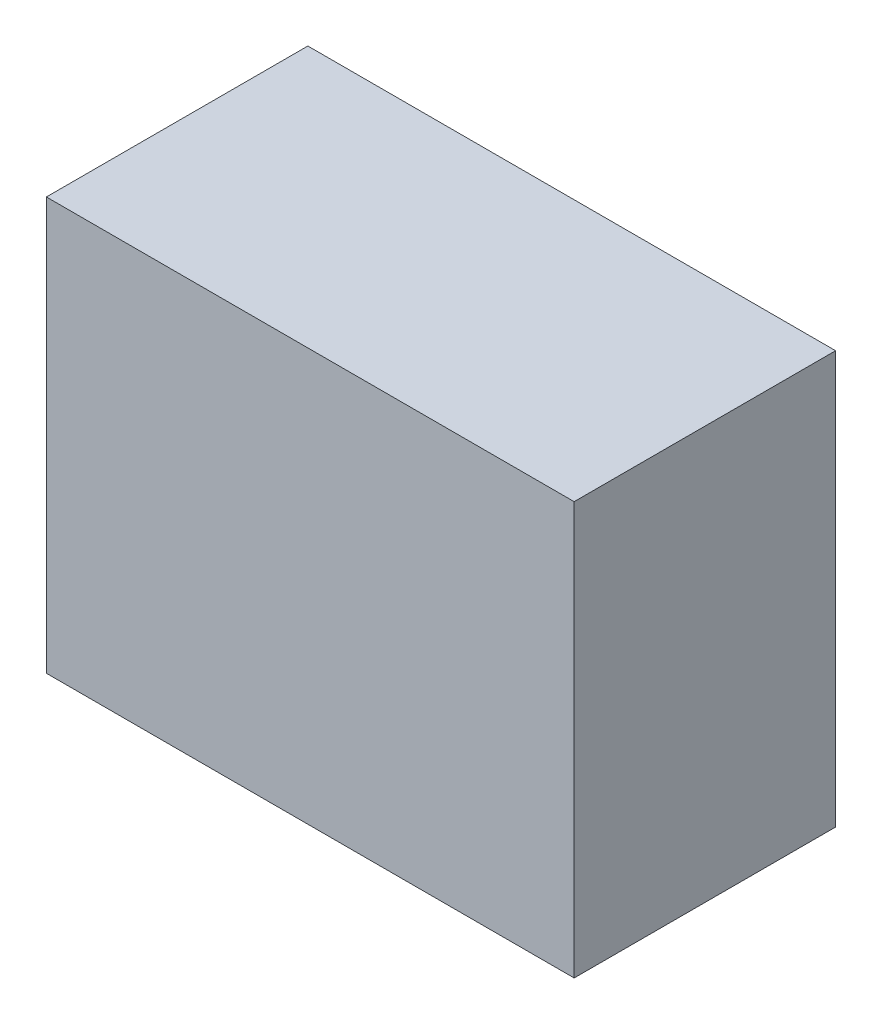
ISO-10303-21;
HEADER;
FILE_DESCRIPTION(('STEP AP214'),'2;1');
FILE_NAME('part.step','',(''),(''),'','','');
FILE_SCHEMA(('AUTOMOTIVE_DESIGN { 1 0 10303 214 1 1 1 1 }'));
ENDSEC;
DATA;
#1=APPLICATION_CONTEXT('core data for automotive mechanical design processes');
#2=APPLICATION_PROTOCOL_DEFINITION('international standard','automotive_design',2000,#1);
#3=PRODUCT_CONTEXT('',#1,'mechanical');
#4=PRODUCT('Part','Part','',(#3));
#5=PRODUCT_RELATED_PRODUCT_CATEGORY('part','',(#4));
#6=PRODUCT_DEFINITION_FORMATION('','',#4);
#7=PRODUCT_DEFINITION_CONTEXT('part definition',#1,'design');
#8=PRODUCT_DEFINITION('design','',#6,#7);
#9=PRODUCT_DEFINITION_SHAPE('','',#8);
#10=(LENGTH_UNIT() NAMED_UNIT(*) SI_UNIT(.MILLI.,.METRE.));
#11=(NAMED_UNIT(*) PLANE_ANGLE_UNIT() SI_UNIT($,.RADIAN.));
#12=(NAMED_UNIT(*) SI_UNIT($,.STERADIAN.) SOLID_ANGLE_UNIT());
#13=UNCERTAINTY_MEASURE_WITH_UNIT(LENGTH_MEASURE(1.E-05),#10,'distance_accuracy_value','');
#14=(GEOMETRIC_REPRESENTATION_CONTEXT(3) GLOBAL_UNCERTAINTY_ASSIGNED_CONTEXT((#13)) GLOBAL_UNIT_ASSIGNED_CONTEXT((#10,
#11,#12)) REPRESENTATION_CONTEXT('',''));
#15=CARTESIAN_POINT('',(0.,0.,0.));
#16=DIRECTION('',(0.,0.,1.));
#17=DIRECTION('',(1.,0.,0.));
#18=AXIS2_PLACEMENT_3D('',#15,#16,#17);
#19=CARTESIAN_POINT('',(0.,0.,0.));
#20=DIRECTION('',(0.,0.,1.));
#21=DIRECTION('',(1.,0.,0.));
#22=AXIS2_PLACEMENT_3D('',#19,#20,#21);
#23=PLANE('',#22);
#24=DIRECTION('',(1.,0.,0.));
#25=VECTOR('',#24,1.);
#26=CARTESIAN_POINT('',(-0.4,-0.4,0.));
#27=LINE('',#26,#25);
#28=CARTESIAN_POINT('',(-0.4,-0.4,0.));
#29=VERTEX_POINT('',#28);
#30=CARTESIAN_POINT('',(45.4,-0.4,0.));
#31=VERTEX_POINT('',#30);
#32=EDGE_CURVE('E188',#29,#31,#27,.T.);
#33=ORIENTED_EDGE('',*,*,#32,.F.);
#34=DIRECTION('',(0.,-1.,0.));
#35=VECTOR('',#34,1.);
#36=CARTESIAN_POINT('',(-0.4,-0.4,0.));
#37=LINE('',#36,#35);
#38=CARTESIAN_POINT('',(-0.4,35.4,0.));
#39=VERTEX_POINT('',#38);
#40=EDGE_CURVE('E122',#39,#29,#37,.T.);
#41=ORIENTED_EDGE('',*,*,#40,.F.);
#42=DIRECTION('',(-1.,0.,0.));
#43=VECTOR('',#42,1.);
#44=CARTESIAN_POINT('',(-0.4,35.4,0.));
#45=LINE('',#44,#43);
#46=CARTESIAN_POINT('',(45.4,35.4,0.));
#47=VERTEX_POINT('',#46);
#48=EDGE_CURVE('E194',#47,#39,#45,.T.);
#49=ORIENTED_EDGE('',*,*,#48,.F.);
#50=DIRECTION('',(0.,1.,0.));
#51=VECTOR('',#50,1.);
#52=CARTESIAN_POINT('',(45.4,-0.4,0.));
#53=LINE('',#52,#51);
#54=EDGE_CURVE('E191',#31,#47,#53,.T.);
#55=ORIENTED_EDGE('',*,*,#54,.F.);
#56=EDGE_LOOP('',(#33,#41,#49,#55));
#57=FACE_BOUND('',#56,.T.);
#58=DIRECTION('',(0.,-1.,0.));
#59=VECTOR('',#58,1.);
#60=CARTESIAN_POINT('',(0.,0.,0.));
#61=LINE('',#60,#59);
#62=CARTESIAN_POINT('',(0.,35.,0.));
#63=VERTEX_POINT('',#62);
#64=CARTESIAN_POINT('',(0.,0.,0.));
#65=VERTEX_POINT('',#64);
#66=EDGE_CURVE('E71',#63,#65,#61,.T.);
#67=ORIENTED_EDGE('',*,*,#66,.T.);
#68=DIRECTION('',(1.,0.,0.));
#69=VECTOR('',#68,1.);
#70=CARTESIAN_POINT('',(0.,0.,0.));
#71=LINE('',#70,#69);
#72=CARTESIAN_POINT('',(45.,0.,0.));
#73=VERTEX_POINT('',#72);
#74=EDGE_CURVE('E166',#65,#73,#71,.T.);
#75=ORIENTED_EDGE('',*,*,#74,.T.);
#76=DIRECTION('',(0.,1.,0.));
#77=VECTOR('',#76,1.);
#78=CARTESIAN_POINT('',(45.,0.,0.));
#79=LINE('',#78,#77);
#80=CARTESIAN_POINT('',(45.,35.,0.));
#81=VERTEX_POINT('',#80);
#82=EDGE_CURVE('E170',#73,#81,#79,.T.);
#83=ORIENTED_EDGE('',*,*,#82,.T.);
#84=DIRECTION('',(-1.,0.,0.));
#85=VECTOR('',#84,1.);
#86=CARTESIAN_POINT('',(0.,35.,0.));
#87=LINE('',#86,#85);
#88=EDGE_CURVE('E153',#81,#63,#87,.T.);
#89=ORIENTED_EDGE('',*,*,#88,.T.);
#90=EDGE_LOOP('',(#67,#75,#83,#89));
#91=FACE_BOUND('',#90,.T.);
#92=ADVANCED_FACE('F47',(#57,#91),#23,.F.);
#93=CARTESIAN_POINT('',(-0.4,-0.4,22.14));
#94=DIRECTION('',(0.,1.,0.));
#95=DIRECTION('',(0.,0.,1.));
#96=AXIS2_PLACEMENT_3D('',#93,#94,#95);
#97=PLANE('',#96);
#98=ORIENTED_EDGE('',*,*,#32,.T.);
#99=DIRECTION('',(0.,0.,-1.));
#100=VECTOR('',#99,1.);
#101=CARTESIAN_POINT('',(45.4,-0.4,22.14));
#102=LINE('',#101,#100);
#103=CARTESIAN_POINT('',(45.4,-0.4,22.69));
#104=VERTEX_POINT('',#103);
#105=EDGE_CURVE('E11',#104,#31,#102,.T.);
#106=ORIENTED_EDGE('',*,*,#105,.F.);
#107=DIRECTION('',(1.,0.,0.));
#108=VECTOR('',#107,1.);
#109=CARTESIAN_POINT('',(-0.4,-0.4,22.69));
#110=LINE('',#109,#108);
#111=CARTESIAN_POINT('',(-0.4,-0.4,22.69));
#112=VERTEX_POINT('',#111);
#113=EDGE_CURVE('E130',#112,#104,#110,.T.);
#114=ORIENTED_EDGE('',*,*,#113,.F.);
#115=DIRECTION('',(0.,0.,-1.));
#116=VECTOR('',#115,1.);
#117=CARTESIAN_POINT('',(-0.4,-0.4,22.14));
#118=LINE('',#117,#116);
#119=EDGE_CURVE('E115',#112,#29,#118,.T.);
#120=ORIENTED_EDGE('',*,*,#119,.T.);
#121=EDGE_LOOP('',(#98,#106,#114,#120));
#122=FACE_BOUND('',#121,.T.);
#123=ADVANCED_FACE('F49',(#122),#97,.F.);
#124=CARTESIAN_POINT('',(45.4,-0.4,22.14));
#125=DIRECTION('',(-1.,0.,0.));
#126=DIRECTION('',(0.,0.,1.));
#127=AXIS2_PLACEMENT_3D('',#124,#125,#126);
#128=PLANE('',#127);
#129=ORIENTED_EDGE('',*,*,#54,.T.);
#130=DIRECTION('',(0.,0.,-1.));
#131=VECTOR('',#130,1.);
#132=CARTESIAN_POINT('',(45.4,35.4,22.14));
#133=LINE('',#132,#131);
#134=CARTESIAN_POINT('',(45.4,35.4,22.69));
#135=VERTEX_POINT('',#134);
#136=EDGE_CURVE('E56',#135,#47,#133,.T.);
#137=ORIENTED_EDGE('',*,*,#136,.F.);
#138=DIRECTION('',(0.,1.,0.));
#139=VECTOR('',#138,1.);
#140=CARTESIAN_POINT('',(45.4,-0.4,22.69));
#141=LINE('',#140,#139);
#142=EDGE_CURVE('E135',#104,#135,#141,.T.);
#143=ORIENTED_EDGE('',*,*,#142,.F.);
#144=ORIENTED_EDGE('',*,*,#105,.T.);
#145=EDGE_LOOP('',(#129,#137,#143,#144));
#146=FACE_BOUND('',#145,.T.);
#147=ADVANCED_FACE('F208',(#146),#128,.F.);
#148=CARTESIAN_POINT('',(-0.4,35.4,22.14));
#149=DIRECTION('',(0.,-1.,0.));
#150=DIRECTION('',(0.,0.,-1.));
#151=AXIS2_PLACEMENT_3D('',#148,#149,#150);
#152=PLANE('',#151);
#153=ORIENTED_EDGE('',*,*,#48,.T.);
#154=DIRECTION('',(0.,0.,-1.));
#155=VECTOR('',#154,1.);
#156=CARTESIAN_POINT('',(-0.4,35.4,22.14));
#157=LINE('',#156,#155);
#158=CARTESIAN_POINT('',(-0.4,35.4,22.69));
#159=VERTEX_POINT('',#158);
#160=EDGE_CURVE('E127',#159,#39,#157,.T.);
#161=ORIENTED_EDGE('',*,*,#160,.F.);
#162=DIRECTION('',(-1.,0.,0.));
#163=VECTOR('',#162,1.);
#164=CARTESIAN_POINT('',(-0.4,35.4,22.69));
#165=LINE('',#164,#163);
#166=EDGE_CURVE('E140',#135,#159,#165,.T.);
#167=ORIENTED_EDGE('',*,*,#166,.F.);
#168=ORIENTED_EDGE('',*,*,#136,.T.);
#169=EDGE_LOOP('',(#153,#161,#167,#168));
#170=FACE_BOUND('',#169,.T.);
#171=ADVANCED_FACE('F204',(#170),#152,.F.);
#172=CARTESIAN_POINT('',(-0.4,-0.4,22.14));
#173=DIRECTION('',(1.,0.,0.));
#174=DIRECTION('',(0.,0.,-1.));
#175=AXIS2_PLACEMENT_3D('',#172,#173,#174);
#176=PLANE('',#175);
#177=ORIENTED_EDGE('',*,*,#40,.T.);
#178=ORIENTED_EDGE('',*,*,#119,.F.);
#179=DIRECTION('',(0.,-1.,0.));
#180=VECTOR('',#179,1.);
#181=CARTESIAN_POINT('',(-0.4,-0.4,22.69));
#182=LINE('',#181,#180);
#183=EDGE_CURVE('E120',#159,#112,#182,.T.);
#184=ORIENTED_EDGE('',*,*,#183,.F.);
#185=ORIENTED_EDGE('',*,*,#160,.T.);
#186=EDGE_LOOP('',(#177,#178,#184,#185));
#187=FACE_BOUND('',#186,.T.);
#188=ADVANCED_FACE('F117',(#187),#176,.F.);
#189=CARTESIAN_POINT('',(0.,0.,22.14));
#190=DIRECTION('',(1.,0.,0.));
#191=DIRECTION('',(0.,0.,-1.));
#192=AXIS2_PLACEMENT_3D('',#189,#190,#191);
#193=PLANE('',#192);
#194=ORIENTED_EDGE('',*,*,#66,.F.);
#195=DIRECTION('',(0.,0.,-1.));
#196=VECTOR('',#195,1.);
#197=CARTESIAN_POINT('',(0.,35.,22.14));
#198=LINE('',#197,#196);
#199=CARTESIAN_POINT('',(0.,35.,22.14));
#200=VERTEX_POINT('',#199);
#201=EDGE_CURVE('E163',#200,#63,#198,.T.);
#202=ORIENTED_EDGE('',*,*,#201,.F.);
#203=DIRECTION('',(0.,-1.,0.));
#204=VECTOR('',#203,1.);
#205=CARTESIAN_POINT('',(0.,0.,22.14));
#206=LINE('',#205,#204);
#207=CARTESIAN_POINT('',(0.,0.,22.14));
#208=VERTEX_POINT('',#207);
#209=EDGE_CURVE('E148',#200,#208,#206,.T.);
#210=ORIENTED_EDGE('',*,*,#209,.T.);
#211=DIRECTION('',(0.,0.,-1.));
#212=VECTOR('',#211,1.);
#213=CARTESIAN_POINT('',(0.,0.,22.14));
#214=LINE('',#213,#212);
#215=EDGE_CURVE('E185',#208,#65,#214,.T.);
#216=ORIENTED_EDGE('',*,*,#215,.T.);
#217=EDGE_LOOP('',(#194,#202,#210,#216));
#218=FACE_BOUND('',#217,.T.);
#219=ADVANCED_FACE('F221',(#218),#193,.T.);
#220=CARTESIAN_POINT('',(0.,0.,22.14));
#221=DIRECTION('',(0.,1.,0.));
#222=DIRECTION('',(0.,0.,1.));
#223=AXIS2_PLACEMENT_3D('',#220,#221,#222);
#224=PLANE('',#223);
#225=ORIENTED_EDGE('',*,*,#74,.F.);
#226=ORIENTED_EDGE('',*,*,#215,.F.);
#227=DIRECTION('',(1.,0.,0.));
#228=VECTOR('',#227,1.);
#229=CARTESIAN_POINT('',(0.,0.,22.14));
#230=LINE('',#229,#228);
#231=CARTESIAN_POINT('',(45.,0.,22.14));
#232=VERTEX_POINT('',#231);
#233=EDGE_CURVE('E152',#208,#232,#230,.T.);
#234=ORIENTED_EDGE('',*,*,#233,.T.);
#235=DIRECTION('',(0.,0.,-1.));
#236=VECTOR('',#235,1.);
#237=CARTESIAN_POINT('',(45.,0.,22.14));
#238=LINE('',#237,#236);
#239=EDGE_CURVE('E182',#232,#73,#238,.T.);
#240=ORIENTED_EDGE('',*,*,#239,.T.);
#241=EDGE_LOOP('',(#225,#226,#234,#240));
#242=FACE_BOUND('',#241,.T.);
#243=ADVANCED_FACE('F227',(#242),#224,.T.);
#244=CARTESIAN_POINT('',(45.,0.,22.14));
#245=DIRECTION('',(-1.,0.,0.));
#246=DIRECTION('',(0.,0.,1.));
#247=AXIS2_PLACEMENT_3D('',#244,#245,#246);
#248=PLANE('',#247);
#249=ORIENTED_EDGE('',*,*,#82,.F.);
#250=ORIENTED_EDGE('',*,*,#239,.F.);
#251=DIRECTION('',(0.,1.,0.));
#252=VECTOR('',#251,1.);
#253=CARTESIAN_POINT('',(45.,0.,22.14));
#254=LINE('',#253,#252);
#255=CARTESIAN_POINT('',(45.,35.,22.14));
#256=VERTEX_POINT('',#255);
#257=EDGE_CURVE('E157',#232,#256,#254,.T.);
#258=ORIENTED_EDGE('',*,*,#257,.T.);
#259=DIRECTION('',(0.,0.,-1.));
#260=VECTOR('',#259,1.);
#261=CARTESIAN_POINT('',(45.,35.,22.14));
#262=LINE('',#261,#260);
#263=EDGE_CURVE('E179',#256,#81,#262,.T.);
#264=ORIENTED_EDGE('',*,*,#263,.T.);
#265=EDGE_LOOP('',(#249,#250,#258,#264));
#266=FACE_BOUND('',#265,.T.);
#267=ADVANCED_FACE('F231',(#266),#248,.T.);
#268=CARTESIAN_POINT('',(0.,35.,22.14));
#269=DIRECTION('',(0.,-1.,0.));
#270=DIRECTION('',(0.,0.,-1.));
#271=AXIS2_PLACEMENT_3D('',#268,#269,#270);
#272=PLANE('',#271);
#273=ORIENTED_EDGE('',*,*,#88,.F.);
#274=ORIENTED_EDGE('',*,*,#263,.F.);
#275=DIRECTION('',(-1.,0.,0.));
#276=VECTOR('',#275,1.);
#277=CARTESIAN_POINT('',(0.,35.,22.14));
#278=LINE('',#277,#276);
#279=EDGE_CURVE('E63',#256,#200,#278,.T.);
#280=ORIENTED_EDGE('',*,*,#279,.T.);
#281=ORIENTED_EDGE('',*,*,#201,.T.);
#282=EDGE_LOOP('',(#273,#274,#280,#281));
#283=FACE_BOUND('',#282,.T.);
#284=ADVANCED_FACE('F236',(#283),#272,.T.);
#285=CARTESIAN_POINT('',(0.,0.,22.14));
#286=DIRECTION('',(0.,0.,-1.));
#287=DIRECTION('',(-1.,0.,0.));
#288=AXIS2_PLACEMENT_3D('',#285,#286,#287);
#289=PLANE('',#288);
#290=ORIENTED_EDGE('',*,*,#233,.F.);
#291=ORIENTED_EDGE('',*,*,#209,.F.);
#292=ORIENTED_EDGE('',*,*,#279,.F.);
#293=ORIENTED_EDGE('',*,*,#257,.F.);
#294=EDGE_LOOP('',(#290,#291,#292,#293));
#295=FACE_BOUND('',#294,.T.);
#296=ADVANCED_FACE('F242',(#295),#289,.T.);
#297=CARTESIAN_POINT('',(0.,0.,22.69));
#298=DIRECTION('',(0.,0.,-1.));
#299=DIRECTION('',(-1.,0.,0.));
#300=AXIS2_PLACEMENT_3D('',#297,#298,#299);
#301=PLANE('',#300);
#302=ORIENTED_EDGE('',*,*,#183,.T.);
#303=ORIENTED_EDGE('',*,*,#113,.T.);
#304=ORIENTED_EDGE('',*,*,#142,.T.);
#305=ORIENTED_EDGE('',*,*,#166,.T.);
#306=EDGE_LOOP('',(#302,#303,#304,#305));
#307=FACE_BOUND('',#306,.T.);
#308=ADVANCED_FACE('F138',(#307),#301,.F.);
#309=CLOSED_SHELL('',(#92,#123,#147,#171,#188,#219,#243,#267,#284,#296,#308));
#310=MANIFOLD_SOLID_BREP('B2',#309);
#311=ADVANCED_BREP_SHAPE_REPRESENTATION('',(#18,#310),#14);
#312=SHAPE_DEFINITION_REPRESENTATION(#9,#311);
ENDSEC;
END-ISO-10303-21;
